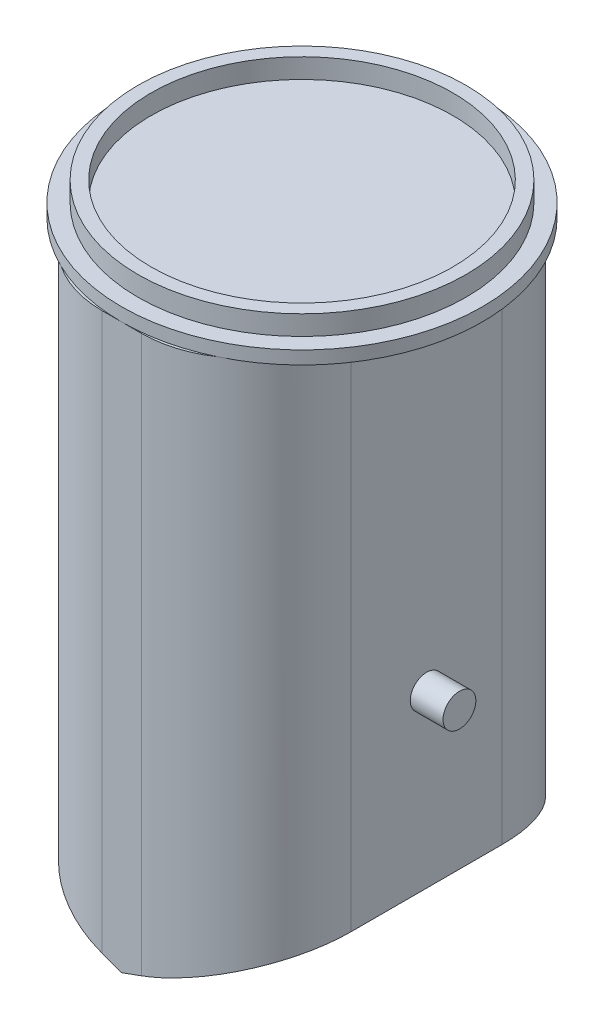
ISO-10303-21;
HEADER;
FILE_DESCRIPTION(('STEP AP214'),'2;1');
FILE_NAME('part.step','',(''),(''),'','','');
FILE_SCHEMA(('AUTOMOTIVE_DESIGN { 1 0 10303 214 1 1 1 1 }'));
ENDSEC;
DATA;
#1=APPLICATION_CONTEXT('core data for automotive mechanical design processes');
#2=APPLICATION_PROTOCOL_DEFINITION('international standard','automotive_design',2000,#1);
#3=PRODUCT_CONTEXT('',#1,'mechanical');
#4=PRODUCT('Part','Part','',(#3));
#5=PRODUCT_RELATED_PRODUCT_CATEGORY('part','',(#4));
#6=PRODUCT_DEFINITION_FORMATION('','',#4);
#7=PRODUCT_DEFINITION_CONTEXT('part definition',#1,'design');
#8=PRODUCT_DEFINITION('design','',#6,#7);
#9=PRODUCT_DEFINITION_SHAPE('','',#8);
#10=(LENGTH_UNIT() NAMED_UNIT(*) SI_UNIT(.MILLI.,.METRE.));
#11=(NAMED_UNIT(*) PLANE_ANGLE_UNIT() SI_UNIT($,.RADIAN.));
#12=(NAMED_UNIT(*) SI_UNIT($,.STERADIAN.) SOLID_ANGLE_UNIT());
#13=UNCERTAINTY_MEASURE_WITH_UNIT(LENGTH_MEASURE(1.E-05),#10,'distance_accuracy_value','');
#14=(GEOMETRIC_REPRESENTATION_CONTEXT(3) GLOBAL_UNCERTAINTY_ASSIGNED_CONTEXT((#13)) GLOBAL_UNIT_ASSIGNED_CONTEXT((#10,
#11,#12)) REPRESENTATION_CONTEXT('',''));
#15=CARTESIAN_POINT('',(0.,0.,0.));
#16=DIRECTION('',(0.,0.,1.));
#17=DIRECTION('',(1.,0.,0.));
#18=AXIS2_PLACEMENT_3D('',#15,#16,#17);
#19=CARTESIAN_POINT('',(0.,0.,0.));
#20=DIRECTION('',(0.,1.,0.));
#21=DIRECTION('',(0.,0.,1.));
#22=AXIS2_PLACEMENT_3D('',#19,#20,#21);
#23=PLANE('',#22);
#24=CARTESIAN_POINT('',(-3.,0.,-11.5));
#25=DIRECTION('',(0.,-1.,0.));
#26=DIRECTION('',(0.,0.,1.));
#27=AXIS2_PLACEMENT_3D('',#24,#25,#26);
#28=CIRCLE('',#27,16.);
#29=CARTESIAN_POINT('',(-19.,0.,-11.5));
#30=VERTEX_POINT('',#29);
#31=CARTESIAN_POINT('',(-11.9226578433651,0.,-24.7810457799917));
#32=VERTEX_POINT('',#31);
#33=EDGE_CURVE('E174',#30,#32,#28,.T.);
#34=ORIENTED_EDGE('',*,*,#33,.F.);
#35=DIRECTION('',(0.,0.,-1.));
#36=VECTOR('',#35,1.);
#37=CARTESIAN_POINT('',(-19.,0.,-11.5));
#38=LINE('',#37,#36);
#39=CARTESIAN_POINT('',(-19.,0.,11.5));
#40=VERTEX_POINT('',#39);
#41=EDGE_CURVE('E169',#40,#30,#38,.T.);
#42=ORIENTED_EDGE('',*,*,#41,.F.);
#43=CARTESIAN_POINT('',(-3.,0.,11.5));
#44=DIRECTION('',(0.,-1.,0.));
#45=DIRECTION('',(0.,0.,-1.));
#46=AXIS2_PLACEMENT_3D('',#43,#44,#45);
#47=CIRCLE('',#46,16.);
#48=CARTESIAN_POINT('',(-11.9226578433651,0.,24.7810457799917));
#49=VERTEX_POINT('',#48);
#50=EDGE_CURVE('E170',#49,#40,#47,.T.);
#51=ORIENTED_EDGE('',*,*,#50,.F.);
#52=CARTESIAN_POINT('',(0.,0.,0.));
#53=DIRECTION('',(0.,1.,0.));
#54=DIRECTION('',(0.,0.,1.));
#55=AXIS2_PLACEMENT_3D('',#52,#53,#54);
#56=CIRCLE('',#55,27.5);
#57=EDGE_CURVE('E293',#32,#49,#56,.T.);
#58=ORIENTED_EDGE('',*,*,#57,.F.);
#59=EDGE_LOOP('',(#34,#42,#51,#58));
#60=FACE_BOUND('',#59,.T.);
#61=ADVANCED_FACE('F37',(#60),#23,.F.);
#62=CARTESIAN_POINT('',(3.,0.,-11.5));
#63=DIRECTION('',(0.,-1.,0.));
#64=DIRECTION('',(0.,0.,-1.));
#65=AXIS2_PLACEMENT_3D('',#62,#63,#64);
#66=CIRCLE('',#65,16.);
#67=CARTESIAN_POINT('',(11.9226578433651,0.,-24.7810457799917));
#68=VERTEX_POINT('',#67);
#69=CARTESIAN_POINT('',(19.,0.,-11.5));
#70=VERTEX_POINT('',#69);
#71=EDGE_CURVE('E160',#68,#70,#66,.T.);
#72=ORIENTED_EDGE('',*,*,#71,.F.);
#73=CARTESIAN_POINT('',(11.9226578433651,0.,24.7810457799917));
#74=VERTEX_POINT('',#73);
#75=EDGE_CURVE('E148',#74,#68,#56,.T.);
#76=ORIENTED_EDGE('',*,*,#75,.F.);
#77=CARTESIAN_POINT('',(3.,0.,11.5));
#78=DIRECTION('',(0.,-1.,0.));
#79=DIRECTION('',(0.,0.,-1.));
#80=AXIS2_PLACEMENT_3D('',#77,#78,#79);
#81=CIRCLE('',#80,16.);
#82=CARTESIAN_POINT('',(19.,0.,11.5));
#83=VERTEX_POINT('',#82);
#84=EDGE_CURVE('E132',#83,#74,#81,.T.);
#85=ORIENTED_EDGE('',*,*,#84,.F.);
#86=DIRECTION('',(0.,0.,1.));
#87=VECTOR('',#86,1.);
#88=CARTESIAN_POINT('',(19.,0.,-11.5));
#89=LINE('',#88,#87);
#90=EDGE_CURVE('E145',#70,#83,#89,.T.);
#91=ORIENTED_EDGE('',*,*,#90,.F.);
#92=EDGE_LOOP('',(#72,#76,#85,#91));
#93=FACE_BOUND('',#92,.T.);
#94=ADVANCED_FACE('F144',(#93),#23,.F.);
#95=CARTESIAN_POINT('',(0.,2.,0.));
#96=DIRECTION('',(0.,-1.,0.));
#97=DIRECTION('',(0.,0.,-1.));
#98=AXIS2_PLACEMENT_3D('',#95,#96,#97);
#99=CYLINDRICAL_SURFACE('',#98,27.5);
#100=CARTESIAN_POINT('',(0.,2.,0.));
#101=DIRECTION('',(0.,1.,0.));
#102=DIRECTION('',(0.,0.,1.));
#103=AXIS2_PLACEMENT_3D('',#100,#101,#102);
#104=CIRCLE('',#103,27.5);
#105=CARTESIAN_POINT('',(0.,2.,27.5));
#106=VERTEX_POINT('',#105);
#107=EDGE_CURVE('E203',#106,#106,#104,.T.);
#108=ORIENTED_EDGE('',*,*,#107,.F.);
#109=EDGE_LOOP('',(#108));
#110=FACE_BOUND('',#109,.T.);
#111=CARTESIAN_POINT('',(0.,0.,27.5));
#112=VERTEX_POINT('',#111);
#113=EDGE_CURVE('E207',#112,#74,#56,.T.);
#114=ORIENTED_EDGE('',*,*,#113,.T.);
#115=ORIENTED_EDGE('',*,*,#75,.T.);
#116=CARTESIAN_POINT('',(0.,0.,-27.5));
#117=VERTEX_POINT('',#116);
#118=EDGE_CURVE('E312',#68,#117,#56,.T.);
#119=ORIENTED_EDGE('',*,*,#118,.T.);
#120=EDGE_CURVE('E299',#117,#32,#56,.T.);
#121=ORIENTED_EDGE('',*,*,#120,.T.);
#122=ORIENTED_EDGE('',*,*,#57,.T.);
#123=EDGE_CURVE('E200',#49,#112,#56,.T.);
#124=ORIENTED_EDGE('',*,*,#123,.T.);
#125=EDGE_LOOP('',(#114,#115,#119,#121,#122,#124));
#126=FACE_BOUND('',#125,.T.);
#127=ADVANCED_FACE('F264',(#110,#126),#99,.T.);
#128=CARTESIAN_POINT('',(0.,2.,0.));
#129=DIRECTION('',(0.,1.,0.));
#130=DIRECTION('',(0.,0.,1.));
#131=AXIS2_PLACEMENT_3D('',#128,#129,#130);
#132=PLANE('',#131);
#133=CARTESIAN_POINT('',(0.,2.,0.));
#134=DIRECTION('',(0.,1.,0.));
#135=DIRECTION('',(0.,0.,1.));
#136=AXIS2_PLACEMENT_3D('',#133,#134,#135);
#137=CIRCLE('',#136,25.);
#138=CARTESIAN_POINT('',(0.,2.,25.));
#139=VERTEX_POINT('',#138);
#140=EDGE_CURVE('E196',#139,#139,#137,.T.);
#141=ORIENTED_EDGE('',*,*,#140,.F.);
#142=EDGE_LOOP('',(#141));
#143=FACE_BOUND('',#142,.T.);
#144=ORIENTED_EDGE('',*,*,#107,.T.);
#145=EDGE_LOOP('',(#144));
#146=FACE_BOUND('',#145,.T.);
#147=ADVANCED_FACE('F268',(#143,#146),#132,.T.);
#148=CARTESIAN_POINT('',(0.,5.,0.));
#149=DIRECTION('',(0.,1.,0.));
#150=DIRECTION('',(0.,0.,1.));
#151=AXIS2_PLACEMENT_3D('',#148,#149,#150);
#152=PLANE('',#151);
#153=CARTESIAN_POINT('',(0.,5.,0.));
#154=DIRECTION('',(0.,1.,0.));
#155=DIRECTION('',(0.,0.,1.));
#156=AXIS2_PLACEMENT_3D('',#153,#154,#155);
#157=CIRCLE('',#156,25.);
#158=CARTESIAN_POINT('',(0.,5.,25.));
#159=VERTEX_POINT('',#158);
#160=EDGE_CURVE('E197',#159,#159,#157,.T.);
#161=ORIENTED_EDGE('',*,*,#160,.T.);
#162=EDGE_LOOP('',(#161));
#163=FACE_BOUND('',#162,.T.);
#164=CARTESIAN_POINT('',(0.,5.,0.));
#165=DIRECTION('',(0.,1.,0.));
#166=DIRECTION('',(0.,0.,1.));
#167=AXIS2_PLACEMENT_3D('',#164,#165,#166);
#168=CIRCLE('',#167,23.);
#169=CARTESIAN_POINT('',(0.,5.,23.));
#170=VERTEX_POINT('',#169);
#171=EDGE_CURVE('E193',#170,#170,#168,.T.);
#172=ORIENTED_EDGE('',*,*,#171,.F.);
#173=EDGE_LOOP('',(#172));
#174=FACE_BOUND('',#173,.T.);
#175=ADVANCED_FACE('F353',(#163,#174),#152,.T.);
#176=CARTESIAN_POINT('',(0.,5.,0.));
#177=DIRECTION('',(0.,-1.,0.));
#178=DIRECTION('',(0.,0.,-1.));
#179=AXIS2_PLACEMENT_3D('',#176,#177,#178);
#180=CYLINDRICAL_SURFACE('',#179,25.);
#181=ORIENTED_EDGE('',*,*,#160,.F.);
#182=EDGE_LOOP('',(#181));
#183=FACE_BOUND('',#182,.T.);
#184=ORIENTED_EDGE('',*,*,#140,.T.);
#185=EDGE_LOOP('',(#184));
#186=FACE_BOUND('',#185,.T.);
#187=ADVANCED_FACE('F351',(#183,#186),#180,.T.);
#188=CARTESIAN_POINT('',(0.,5.,0.));
#189=DIRECTION('',(0.,-1.,0.));
#190=DIRECTION('',(0.,0.,-1.));
#191=AXIS2_PLACEMENT_3D('',#188,#189,#190);
#192=CYLINDRICAL_SURFACE('',#191,23.);
#193=ORIENTED_EDGE('',*,*,#171,.T.);
#194=EDGE_LOOP('',(#193));
#195=FACE_BOUND('',#194,.T.);
#196=CARTESIAN_POINT('',(0.,2.,0.));
#197=DIRECTION('',(0.,1.,0.));
#198=DIRECTION('',(0.,0.,1.));
#199=AXIS2_PLACEMENT_3D('',#196,#197,#198);
#200=CIRCLE('',#199,23.);
#201=CARTESIAN_POINT('',(0.,2.,23.));
#202=VERTEX_POINT('',#201);
#203=EDGE_CURVE('E206',#202,#202,#200,.F.);
#204=ORIENTED_EDGE('',*,*,#203,.T.);
#205=EDGE_LOOP('',(#204));
#206=FACE_BOUND('',#205,.T.);
#207=ADVANCED_FACE('F347',(#195,#206),#192,.F.);
#208=ORIENTED_EDGE('',*,*,#203,.F.);
#209=EDGE_LOOP('',(#208));
#210=FACE_BOUND('',#209,.T.);
#211=ADVANCED_FACE('F350',(#210),#132,.T.);
#212=CARTESIAN_POINT('',(3.,0.,-11.5));
#213=DIRECTION('',(0.,-1.,0.));
#214=DIRECTION('',(0.,0.,-1.));
#215=AXIS2_PLACEMENT_3D('',#212,#213,#214);
#216=PLANE('',#215);
#217=ORIENTED_EDGE('',*,*,#118,.F.);
#218=CARTESIAN_POINT('',(3.,0.,-27.5));
#219=VERTEX_POINT('',#218);
#220=EDGE_CURVE('E155',#219,#68,#66,.T.);
#221=ORIENTED_EDGE('',*,*,#220,.F.);
#222=DIRECTION('',(1.,0.,0.));
#223=VECTOR('',#222,1.);
#224=CARTESIAN_POINT('',(3.,0.,-27.5));
#225=LINE('',#224,#223);
#226=EDGE_CURVE('E177',#117,#219,#225,.T.);
#227=ORIENTED_EDGE('',*,*,#226,.F.);
#228=EDGE_LOOP('',(#217,#221,#227));
#229=FACE_BOUND('',#228,.T.);
#230=ADVANCED_FACE('F315',(#229),#216,.F.);
#231=ORIENTED_EDGE('',*,*,#120,.F.);
#232=CARTESIAN_POINT('',(-3.,0.,-27.5));
#233=VERTEX_POINT('',#232);
#234=EDGE_CURVE('E178',#233,#117,#225,.T.);
#235=ORIENTED_EDGE('',*,*,#234,.F.);
#236=EDGE_CURVE('E173',#32,#233,#28,.T.);
#237=ORIENTED_EDGE('',*,*,#236,.F.);
#238=EDGE_LOOP('',(#231,#235,#237));
#239=FACE_BOUND('',#238,.T.);
#240=ADVANCED_FACE('F322',(#239),#216,.F.);
#241=ORIENTED_EDGE('',*,*,#113,.F.);
#242=DIRECTION('',(-1.,0.,0.));
#243=VECTOR('',#242,1.);
#244=CARTESIAN_POINT('',(3.,0.,27.5));
#245=LINE('',#244,#243);
#246=CARTESIAN_POINT('',(3.,0.,27.5));
#247=VERTEX_POINT('',#246);
#248=EDGE_CURVE('E163',#247,#112,#245,.T.);
#249=ORIENTED_EDGE('',*,*,#248,.F.);
#250=EDGE_CURVE('E151',#74,#247,#81,.T.);
#251=ORIENTED_EDGE('',*,*,#250,.F.);
#252=EDGE_LOOP('',(#241,#249,#251));
#253=FACE_BOUND('',#252,.T.);
#254=ADVANCED_FACE('F310',(#253),#216,.F.);
#255=CARTESIAN_POINT('',(3.,-87.,-11.5));
#256=DIRECTION('',(0.,1.,0.));
#257=DIRECTION('',(0.,0.,1.));
#258=AXIS2_PLACEMENT_3D('',#255,#256,#257);
#259=CYLINDRICAL_SURFACE('',#258,16.);
#260=DIRECTION('',(0.,1.,0.));
#261=VECTOR('',#260,1.);
#262=CARTESIAN_POINT('',(19.,-87.,-11.5));
#263=LINE('',#262,#261);
#264=CARTESIAN_POINT('',(19.,-79.,-11.5));
#265=VERTEX_POINT('',#264);
#266=EDGE_CURVE('E139',#265,#70,#263,.T.);
#267=ORIENTED_EDGE('',*,*,#266,.F.);
#268=CARTESIAN_POINT('',(3.,-84.8235237482592,-11.5));
#269=DIRECTION('',(0.342020143325669,-0.939692620785908,0.));
#270=DIRECTION('',(0.939692620785908,0.342020143325669,0.));
#271=AXIS2_PLACEMENT_3D('',#268,#269,#270);
#272=ELLIPSE('',#271,17.0268443596146,16.);
#273=CARTESIAN_POINT('',(3.,-84.8235237482592,-27.5));
#274=VERTEX_POINT('',#273);
#275=EDGE_CURVE('E218',#265,#274,#272,.F.);
#276=ORIENTED_EDGE('',*,*,#275,.T.);
#277=DIRECTION('',(0.,1.,0.));
#278=VECTOR('',#277,1.);
#279=CARTESIAN_POINT('',(3.,-87.,-27.5));
#280=LINE('',#279,#278);
#281=EDGE_CURVE('E181',#274,#219,#280,.T.);
#282=ORIENTED_EDGE('',*,*,#281,.T.);
#283=ORIENTED_EDGE('',*,*,#220,.T.);
#284=ORIENTED_EDGE('',*,*,#71,.T.);
#285=EDGE_LOOP('',(#267,#276,#282,#283,#284));
#286=FACE_BOUND('',#285,.T.);
#287=ADVANCED_FACE('F284',(#286),#259,.T.);
#288=CARTESIAN_POINT('',(19.,-87.,-11.5));
#289=DIRECTION('',(-1.,0.,0.));
#290=DIRECTION('',(0.,0.,1.));
#291=AXIS2_PLACEMENT_3D('',#288,#289,#290);
#292=PLANE('',#291);
#293=CARTESIAN_POINT('',(19.,-53.,0.));
#294=DIRECTION('',(-1.,0.,0.));
#295=DIRECTION('',(0.,0.,1.));
#296=AXIS2_PLACEMENT_3D('',#293,#294,#295);
#297=CIRCLE('',#296,2.5);
#298=CARTESIAN_POINT('',(19.,-53.,2.5));
#299=VERTEX_POINT('',#298);
#300=EDGE_CURVE('E237',#299,#299,#297,.T.);
#301=ORIENTED_EDGE('',*,*,#300,.T.);
#302=EDGE_LOOP('',(#301));
#303=FACE_BOUND('',#302,.T.);
#304=DIRECTION('',(0.,1.,0.));
#305=VECTOR('',#304,1.);
#306=CARTESIAN_POINT('',(19.,-87.,11.5));
#307=LINE('',#306,#305);
#308=CARTESIAN_POINT('',(19.,-79.,11.5));
#309=VERTEX_POINT('',#308);
#310=EDGE_CURVE('E127',#309,#83,#307,.T.);
#311=ORIENTED_EDGE('',*,*,#310,.F.);
#312=DIRECTION('',(0.,0.,-1.));
#313=VECTOR('',#312,1.);
#314=CARTESIAN_POINT('',(19.,-79.,-11.5));
#315=LINE('',#314,#313);
#316=EDGE_CURVE('E216',#309,#265,#315,.T.);
#317=ORIENTED_EDGE('',*,*,#316,.T.);
#318=ORIENTED_EDGE('',*,*,#266,.T.);
#319=ORIENTED_EDGE('',*,*,#90,.T.);
#320=EDGE_LOOP('',(#311,#317,#318,#319));
#321=FACE_BOUND('',#320,.T.);
#322=ADVANCED_FACE('F153',(#303,#321),#292,.F.);
#323=CARTESIAN_POINT('',(3.,-87.,11.5));
#324=DIRECTION('',(0.,1.,0.));
#325=DIRECTION('',(0.,0.,1.));
#326=AXIS2_PLACEMENT_3D('',#323,#324,#325);
#327=CYLINDRICAL_SURFACE('',#326,16.);
#328=DIRECTION('',(0.,1.,0.));
#329=VECTOR('',#328,1.);
#330=CARTESIAN_POINT('',(3.,-87.,27.5));
#331=LINE('',#330,#329);
#332=CARTESIAN_POINT('',(3.,-84.8235237482592,27.5));
#333=VERTEX_POINT('',#332);
#334=EDGE_CURVE('E140',#333,#247,#331,.T.);
#335=ORIENTED_EDGE('',*,*,#334,.F.);
#336=CARTESIAN_POINT('',(3.,-84.8235237482592,11.5));
#337=DIRECTION('',(0.342020143325669,-0.939692620785908,0.));
#338=DIRECTION('',(0.939692620785908,0.342020143325669,0.));
#339=AXIS2_PLACEMENT_3D('',#336,#337,#338);
#340=ELLIPSE('',#339,17.0268443596146,16.);
#341=EDGE_CURVE('E134',#333,#309,#340,.F.);
#342=ORIENTED_EDGE('',*,*,#341,.T.);
#343=ORIENTED_EDGE('',*,*,#310,.T.);
#344=ORIENTED_EDGE('',*,*,#84,.T.);
#345=ORIENTED_EDGE('',*,*,#250,.T.);
#346=EDGE_LOOP('',(#335,#342,#343,#344,#345));
#347=FACE_BOUND('',#346,.T.);
#348=ADVANCED_FACE('F130',(#347),#327,.T.);
#349=CARTESIAN_POINT('',(3.,-87.,27.5));
#350=DIRECTION('',(0.,0.,-1.));
#351=DIRECTION('',(-1.,0.,0.));
#352=AXIS2_PLACEMENT_3D('',#349,#350,#351);
#353=PLANE('',#352);
#354=DIRECTION('',(0.939692620785908,-0.342020143325669,0.));
#355=VECTOR('',#354,1.);
#356=CARTESIAN_POINT('',(2.97981935563695,-87.,27.5));
#357=LINE('',#356,#355);
#358=CARTESIAN_POINT('',(-3.,-84.8235237482592,27.5));
#359=VERTEX_POINT('',#358);
#360=CARTESIAN_POINT('',(0.,-85.9154344510578,27.5));
#361=VERTEX_POINT('',#360);
#362=EDGE_CURVE('E211',#359,#361,#357,.T.);
#363=ORIENTED_EDGE('',*,*,#362,.T.);
#364=DIRECTION('',(0.939692620785908,0.342020143325669,0.));
#365=VECTOR('',#364,1.);
#366=CARTESIAN_POINT('',(-2.97981935563695,-87.,27.5));
#367=LINE('',#366,#365);
#368=EDGE_CURVE('E213',#361,#333,#367,.T.);
#369=ORIENTED_EDGE('',*,*,#368,.T.);
#370=ORIENTED_EDGE('',*,*,#334,.T.);
#371=ORIENTED_EDGE('',*,*,#248,.T.);
#372=CARTESIAN_POINT('',(-3.,0.,27.5));
#373=VERTEX_POINT('',#372);
#374=EDGE_CURVE('E150',#112,#373,#245,.T.);
#375=ORIENTED_EDGE('',*,*,#374,.T.);
#376=DIRECTION('',(0.,1.,0.));
#377=VECTOR('',#376,1.);
#378=CARTESIAN_POINT('',(-3.,-87.,27.5));
#379=LINE('',#378,#377);
#380=EDGE_CURVE('E189',#359,#373,#379,.T.);
#381=ORIENTED_EDGE('',*,*,#380,.F.);
#382=EDGE_LOOP('',(#363,#369,#370,#371,#375,#381));
#383=FACE_BOUND('',#382,.T.);
#384=ADVANCED_FACE('F307',(#383),#353,.F.);
#385=CARTESIAN_POINT('',(-3.,-87.,11.5));
#386=DIRECTION('',(0.,1.,0.));
#387=DIRECTION('',(0.,0.,1.));
#388=AXIS2_PLACEMENT_3D('',#385,#386,#387);
#389=CYLINDRICAL_SURFACE('',#388,16.);
#390=DIRECTION('',(0.,1.,0.));
#391=VECTOR('',#390,1.);
#392=CARTESIAN_POINT('',(-19.,-87.,11.5));
#393=LINE('',#392,#391);
#394=CARTESIAN_POINT('',(-19.,-79.,11.5));
#395=VERTEX_POINT('',#394);
#396=EDGE_CURVE('E187',#395,#40,#393,.T.);
#397=ORIENTED_EDGE('',*,*,#396,.F.);
#398=CARTESIAN_POINT('',(-3.,-84.8235237482592,11.5));
#399=DIRECTION('',(-0.342020143325669,-0.939692620785908,0.));
#400=DIRECTION('',(-0.939692620785908,0.342020143325669,0.));
#401=AXIS2_PLACEMENT_3D('',#398,#399,#400);
#402=ELLIPSE('',#401,17.0268443596146,16.);
#403=EDGE_CURVE('E45',#395,#359,#402,.F.);
#404=ORIENTED_EDGE('',*,*,#403,.T.);
#405=ORIENTED_EDGE('',*,*,#380,.T.);
#406=EDGE_CURVE('E166',#373,#49,#47,.T.);
#407=ORIENTED_EDGE('',*,*,#406,.T.);
#408=ORIENTED_EDGE('',*,*,#50,.T.);
#409=EDGE_LOOP('',(#397,#404,#405,#407,#408));
#410=FACE_BOUND('',#409,.T.);
#411=ADVANCED_FACE('F288',(#410),#389,.T.);
#412=CARTESIAN_POINT('',(-19.,-87.,-11.5));
#413=DIRECTION('',(1.,0.,0.));
#414=DIRECTION('',(0.,0.,-1.));
#415=AXIS2_PLACEMENT_3D('',#412,#413,#414);
#416=PLANE('',#415);
#417=CARTESIAN_POINT('',(-19.,-53.,0.));
#418=DIRECTION('',(1.,0.,0.));
#419=DIRECTION('',(0.,0.,-1.));
#420=AXIS2_PLACEMENT_3D('',#417,#418,#419);
#421=CIRCLE('',#420,2.5);
#422=CARTESIAN_POINT('',(-19.,-53.,-2.50000000000001));
#423=VERTEX_POINT('',#422);
#424=EDGE_CURVE('E11',#423,#423,#421,.F.);
#425=ORIENTED_EDGE('',*,*,#424,.F.);
#426=EDGE_LOOP('',(#425));
#427=FACE_BOUND('',#426,.T.);
#428=DIRECTION('',(0.,1.,0.));
#429=VECTOR('',#428,1.);
#430=CARTESIAN_POINT('',(-19.,-87.,-11.5));
#431=LINE('',#430,#429);
#432=CARTESIAN_POINT('',(-19.,-79.,-11.5));
#433=VERTEX_POINT('',#432);
#434=EDGE_CURVE('E185',#433,#30,#431,.T.);
#435=ORIENTED_EDGE('',*,*,#434,.F.);
#436=DIRECTION('',(0.,0.,1.));
#437=VECTOR('',#436,1.);
#438=CARTESIAN_POINT('',(-19.,-79.,11.5));
#439=LINE('',#438,#437);
#440=EDGE_CURVE('E52',#433,#395,#439,.T.);
#441=ORIENTED_EDGE('',*,*,#440,.T.);
#442=ORIENTED_EDGE('',*,*,#396,.T.);
#443=ORIENTED_EDGE('',*,*,#41,.T.);
#444=EDGE_LOOP('',(#435,#441,#442,#443));
#445=FACE_BOUND('',#444,.T.);
#446=ADVANCED_FACE('F324',(#427,#445),#416,.F.);
#447=CARTESIAN_POINT('',(-3.,-87.,-11.5));
#448=DIRECTION('',(0.,1.,0.));
#449=DIRECTION('',(0.,0.,1.));
#450=AXIS2_PLACEMENT_3D('',#447,#448,#449);
#451=CYLINDRICAL_SURFACE('',#450,16.);
#452=DIRECTION('',(0.,1.,0.));
#453=VECTOR('',#452,1.);
#454=CARTESIAN_POINT('',(-3.,-87.,-27.5));
#455=LINE('',#454,#453);
#456=CARTESIAN_POINT('',(-3.,-84.8235237482592,-27.5));
#457=VERTEX_POINT('',#456);
#458=EDGE_CURVE('E183',#457,#233,#455,.T.);
#459=ORIENTED_EDGE('',*,*,#458,.F.);
#460=CARTESIAN_POINT('',(-3.,-84.8235237482592,-11.5));
#461=DIRECTION('',(-0.342020143325669,-0.939692620785908,0.));
#462=DIRECTION('',(-0.939692620785908,0.342020143325669,0.));
#463=AXIS2_PLACEMENT_3D('',#460,#461,#462);
#464=ELLIPSE('',#463,17.0268443596146,16.);
#465=EDGE_CURVE('E60',#457,#433,#464,.F.);
#466=ORIENTED_EDGE('',*,*,#465,.T.);
#467=ORIENTED_EDGE('',*,*,#434,.T.);
#468=ORIENTED_EDGE('',*,*,#33,.T.);
#469=ORIENTED_EDGE('',*,*,#236,.T.);
#470=EDGE_LOOP('',(#459,#466,#467,#468,#469));
#471=FACE_BOUND('',#470,.T.);
#472=ADVANCED_FACE('F323',(#471),#451,.T.);
#473=CARTESIAN_POINT('',(3.,-87.,-27.5));
#474=DIRECTION('',(0.,0.,1.));
#475=DIRECTION('',(1.,0.,0.));
#476=AXIS2_PLACEMENT_3D('',#473,#474,#475);
#477=PLANE('',#476);
#478=ORIENTED_EDGE('',*,*,#281,.F.);
#479=DIRECTION('',(-0.939692620785908,-0.342020143325669,0.));
#480=VECTOR('',#479,1.);
#481=CARTESIAN_POINT('',(-2.97981935563696,-87.,-27.5));
#482=LINE('',#481,#480);
#483=CARTESIAN_POINT('',(0.,-85.9154344510578,-27.5));
#484=VERTEX_POINT('',#483);
#485=EDGE_CURVE('E222',#274,#484,#482,.T.);
#486=ORIENTED_EDGE('',*,*,#485,.T.);
#487=DIRECTION('',(-0.939692620785908,0.342020143325669,0.));
#488=VECTOR('',#487,1.);
#489=CARTESIAN_POINT('',(2.97981935563696,-87.,-27.5));
#490=LINE('',#489,#488);
#491=EDGE_CURVE('E220',#484,#457,#490,.T.);
#492=ORIENTED_EDGE('',*,*,#491,.T.);
#493=ORIENTED_EDGE('',*,*,#458,.T.);
#494=ORIENTED_EDGE('',*,*,#234,.T.);
#495=ORIENTED_EDGE('',*,*,#226,.T.);
#496=EDGE_LOOP('',(#478,#486,#492,#493,#494,#495));
#497=FACE_BOUND('',#496,.T.);
#498=ADVANCED_FACE('F319',(#497),#477,.F.);
#499=ORIENTED_EDGE('',*,*,#123,.F.);
#500=ORIENTED_EDGE('',*,*,#406,.F.);
#501=ORIENTED_EDGE('',*,*,#374,.F.);
#502=EDGE_LOOP('',(#499,#500,#501));
#503=FACE_BOUND('',#502,.T.);
#504=ADVANCED_FACE('F280',(#503),#216,.F.);
#505=CARTESIAN_POINT('',(2.97981935563696,-87.,-11.5));
#506=DIRECTION('',(-0.342020143325669,-0.939692620785908,0.));
#507=DIRECTION('',(0.,0.,1.));
#508=AXIS2_PLACEMENT_3D('',#505,#506,#507);
#509=PLANE('',#508);
#510=ORIENTED_EDGE('',*,*,#465,.F.);
#511=ORIENTED_EDGE('',*,*,#491,.F.);
#512=DIRECTION('',(0.,0.,-1.));
#513=VECTOR('',#512,1.);
#514=CARTESIAN_POINT('',(0.,-85.9154344510578,-11.5));
#515=LINE('',#514,#513);
#516=EDGE_CURVE('E158',#361,#484,#515,.T.);
#517=ORIENTED_EDGE('',*,*,#516,.F.);
#518=ORIENTED_EDGE('',*,*,#362,.F.);
#519=ORIENTED_EDGE('',*,*,#403,.F.);
#520=ORIENTED_EDGE('',*,*,#440,.F.);
#521=EDGE_LOOP('',(#510,#511,#517,#518,#519,#520));
#522=FACE_BOUND('',#521,.T.);
#523=ADVANCED_FACE('F39',(#522),#509,.T.);
#524=CARTESIAN_POINT('',(-2.97981935563696,-87.,-11.5));
#525=DIRECTION('',(0.342020143325669,-0.939692620785908,0.));
#526=DIRECTION('',(0.,0.,-1.));
#527=AXIS2_PLACEMENT_3D('',#524,#525,#526);
#528=PLANE('',#527);
#529=ORIENTED_EDGE('',*,*,#275,.F.);
#530=ORIENTED_EDGE('',*,*,#316,.F.);
#531=ORIENTED_EDGE('',*,*,#341,.F.);
#532=ORIENTED_EDGE('',*,*,#368,.F.);
#533=ORIENTED_EDGE('',*,*,#516,.T.);
#534=ORIENTED_EDGE('',*,*,#485,.F.);
#535=EDGE_LOOP('',(#529,#530,#531,#532,#533,#534));
#536=FACE_BOUND('',#535,.T.);
#537=ADVANCED_FACE('F272',(#536),#528,.T.);
#538=CARTESIAN_POINT('',(-24.,-53.,0.));
#539=DIRECTION('',(1.,0.,0.));
#540=DIRECTION('',(0.,0.,-1.));
#541=AXIS2_PLACEMENT_3D('',#538,#539,#540);
#542=CYLINDRICAL_SURFACE('',#541,2.5);
#543=CARTESIAN_POINT('',(-24.,-53.,0.));
#544=DIRECTION('',(-1.,0.,0.));
#545=DIRECTION('',(0.,0.,1.));
#546=AXIS2_PLACEMENT_3D('',#543,#544,#545);
#547=CIRCLE('',#546,2.5);
#548=CARTESIAN_POINT('',(-24.,-53.,2.5));
#549=VERTEX_POINT('',#548);
#550=EDGE_CURVE('E227',#549,#549,#547,.T.);
#551=ORIENTED_EDGE('',*,*,#550,.F.);
#552=EDGE_LOOP('',(#551));
#553=FACE_BOUND('',#552,.T.);
#554=ORIENTED_EDGE('',*,*,#424,.T.);
#555=EDGE_LOOP('',(#554));
#556=FACE_BOUND('',#555,.T.);
#557=ADVANCED_FACE('F256',(#553,#556),#542,.T.);
#558=CARTESIAN_POINT('',(-24.,-53.,0.));
#559=DIRECTION('',(-1.,0.,0.));
#560=DIRECTION('',(0.,0.,1.));
#561=AXIS2_PLACEMENT_3D('',#558,#559,#560);
#562=PLANE('',#561);
#563=ORIENTED_EDGE('',*,*,#550,.T.);
#564=EDGE_LOOP('',(#563));
#565=FACE_BOUND('',#564,.T.);
#566=ADVANCED_FACE('F247',(#565),#562,.T.);
#567=CARTESIAN_POINT('',(24.,-53.,0.));
#568=DIRECTION('',(-1.,0.,0.));
#569=DIRECTION('',(0.,0.,1.));
#570=AXIS2_PLACEMENT_3D('',#567,#568,#569);
#571=CYLINDRICAL_SURFACE('',#570,2.5);
#572=CARTESIAN_POINT('',(24.,-53.,0.));
#573=DIRECTION('',(-1.,0.,0.));
#574=DIRECTION('',(0.,0.,1.));
#575=AXIS2_PLACEMENT_3D('',#572,#573,#574);
#576=CIRCLE('',#575,2.5);
#577=CARTESIAN_POINT('',(24.,-53.,2.5));
#578=VERTEX_POINT('',#577);
#579=EDGE_CURVE('E233',#578,#578,#576,.T.);
#580=ORIENTED_EDGE('',*,*,#579,.T.);
#581=EDGE_LOOP('',(#580));
#582=FACE_BOUND('',#581,.T.);
#583=ORIENTED_EDGE('',*,*,#300,.F.);
#584=EDGE_LOOP('',(#583));
#585=FACE_BOUND('',#584,.T.);
#586=ADVANCED_FACE('F244',(#582,#585),#571,.T.);
#587=CARTESIAN_POINT('',(24.,-53.,0.));
#588=DIRECTION('',(1.,0.,0.));
#589=DIRECTION('',(0.,0.,1.));
#590=AXIS2_PLACEMENT_3D('',#587,#588,#589);
#591=PLANE('',#590);
#592=ORIENTED_EDGE('',*,*,#579,.F.);
#593=EDGE_LOOP('',(#592));
#594=FACE_BOUND('',#593,.T.);
#595=ADVANCED_FACE('F246',(#594),#591,.T.);
#596=CLOSED_SHELL('',(#61,#94,#127,#147,#175,#187,#207,#211,#230,#240,#254,#287,#322,#348,#384,
#411,#446,#472,#498,#504,#523,#537,#557,#566,#586,#595));
#597=MANIFOLD_SOLID_BREP('B2',#596);
#598=ADVANCED_BREP_SHAPE_REPRESENTATION('',(#18,#597),#14);
#599=SHAPE_DEFINITION_REPRESENTATION(#9,#598);
ENDSEC;
END-ISO-10303-21;
